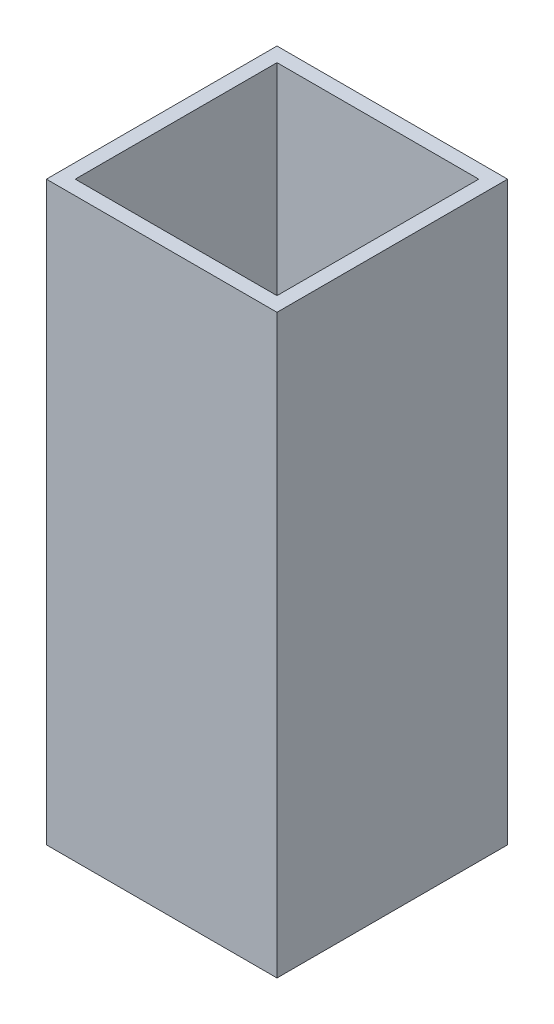
ISO-10303-21;
HEADER;
FILE_DESCRIPTION(('STEP AP214'),'2;1');
FILE_NAME('part.step','',(''),(''),'','','');
FILE_SCHEMA(('AUTOMOTIVE_DESIGN { 1 0 10303 214 1 1 1 1 }'));
ENDSEC;
DATA;
#1=APPLICATION_CONTEXT('core data for automotive mechanical design processes');
#2=APPLICATION_PROTOCOL_DEFINITION('international standard','automotive_design',2000,#1);
#3=PRODUCT_CONTEXT('',#1,'mechanical');
#4=PRODUCT('Part','Part','',(#3));
#5=PRODUCT_RELATED_PRODUCT_CATEGORY('part','',(#4));
#6=PRODUCT_DEFINITION_FORMATION('','',#4);
#7=PRODUCT_DEFINITION_CONTEXT('part definition',#1,'design');
#8=PRODUCT_DEFINITION('design','',#6,#7);
#9=PRODUCT_DEFINITION_SHAPE('','',#8);
#10=(LENGTH_UNIT() NAMED_UNIT(*) SI_UNIT(.MILLI.,.METRE.));
#11=(NAMED_UNIT(*) PLANE_ANGLE_UNIT() SI_UNIT($,.RADIAN.));
#12=(NAMED_UNIT(*) SI_UNIT($,.STERADIAN.) SOLID_ANGLE_UNIT());
#13=UNCERTAINTY_MEASURE_WITH_UNIT(LENGTH_MEASURE(1.E-05),#10,'distance_accuracy_value','');
#14=(GEOMETRIC_REPRESENTATION_CONTEXT(3) GLOBAL_UNCERTAINTY_ASSIGNED_CONTEXT((#13)) GLOBAL_UNIT_ASSIGNED_CONTEXT((#10,
#11,#12)) REPRESENTATION_CONTEXT('',''));
#15=CARTESIAN_POINT('',(0.,0.,0.));
#16=DIRECTION('',(0.,0.,1.));
#17=DIRECTION('',(1.,0.,0.));
#18=AXIS2_PLACEMENT_3D('',#15,#16,#17);
#19=CARTESIAN_POINT('',(0.,63.5,0.));
#20=DIRECTION('',(0.,-1.,0.));
#21=DIRECTION('',(0.,0.,-1.));
#22=AXIS2_PLACEMENT_3D('',#19,#20,#21);
#23=PLANE('',#22);
#24=DIRECTION('',(0.,0.,-1.));
#25=VECTOR('',#24,1.);
#26=CARTESIAN_POINT('',(12.7,63.5,12.7));
#27=LINE('',#26,#25);
#28=CARTESIAN_POINT('',(12.7,63.5,12.7));
#29=VERTEX_POINT('',#28);
#30=CARTESIAN_POINT('',(12.7,63.5,-12.7));
#31=VERTEX_POINT('',#30);
#32=EDGE_CURVE('E133',#29,#31,#27,.T.);
#33=ORIENTED_EDGE('',*,*,#32,.T.);
#34=DIRECTION('',(-1.,0.,0.));
#35=VECTOR('',#34,1.);
#36=CARTESIAN_POINT('',(-12.7,63.5,-12.7));
#37=LINE('',#36,#35);
#38=CARTESIAN_POINT('',(-12.7,63.5,-12.7));
#39=VERTEX_POINT('',#38);
#40=EDGE_CURVE('E136',#31,#39,#37,.T.);
#41=ORIENTED_EDGE('',*,*,#40,.T.);
#42=DIRECTION('',(0.,0.,1.));
#43=VECTOR('',#42,1.);
#44=CARTESIAN_POINT('',(-12.7,63.5,12.7));
#45=LINE('',#44,#43);
#46=CARTESIAN_POINT('',(-12.7,63.5,12.7));
#47=VERTEX_POINT('',#46);
#48=EDGE_CURVE('E139',#39,#47,#45,.T.);
#49=ORIENTED_EDGE('',*,*,#48,.T.);
#50=DIRECTION('',(1.,0.,0.));
#51=VECTOR('',#50,1.);
#52=CARTESIAN_POINT('',(-12.7,63.5,12.7));
#53=LINE('',#52,#51);
#54=EDGE_CURVE('E141',#47,#29,#53,.T.);
#55=ORIENTED_EDGE('',*,*,#54,.T.);
#56=EDGE_LOOP('',(#33,#41,#49,#55));
#57=FACE_BOUND('',#56,.T.);
#58=DIRECTION('',(0.,0.,-1.));
#59=VECTOR('',#58,1.);
#60=CARTESIAN_POINT('',(11.1125,63.5,11.1125));
#61=LINE('',#60,#59);
#62=CARTESIAN_POINT('',(11.1125,63.5,11.1125));
#63=VERTEX_POINT('',#62);
#64=CARTESIAN_POINT('',(11.1125,63.5,-11.1125));
#65=VERTEX_POINT('',#64);
#66=EDGE_CURVE('E97',#63,#65,#61,.T.);
#67=ORIENTED_EDGE('',*,*,#66,.F.);
#68=DIRECTION('',(1.,0.,0.));
#69=VECTOR('',#68,1.);
#70=CARTESIAN_POINT('',(-11.1125,63.5,11.1125));
#71=LINE('',#70,#69);
#72=CARTESIAN_POINT('',(-11.1125,63.5,11.1125));
#73=VERTEX_POINT('',#72);
#74=EDGE_CURVE('E119',#73,#63,#71,.T.);
#75=ORIENTED_EDGE('',*,*,#74,.F.);
#76=DIRECTION('',(0.,0.,1.));
#77=VECTOR('',#76,1.);
#78=CARTESIAN_POINT('',(-11.1125,63.5,11.1125));
#79=LINE('',#78,#77);
#80=CARTESIAN_POINT('',(-11.1125,63.5,-11.1125));
#81=VERTEX_POINT('',#80);
#82=EDGE_CURVE('E117',#81,#73,#79,.T.);
#83=ORIENTED_EDGE('',*,*,#82,.F.);
#84=DIRECTION('',(-1.,0.,0.));
#85=VECTOR('',#84,1.);
#86=CARTESIAN_POINT('',(-11.1125,63.5,-11.1125));
#87=LINE('',#86,#85);
#88=EDGE_CURVE('E105',#65,#81,#87,.T.);
#89=ORIENTED_EDGE('',*,*,#88,.F.);
#90=EDGE_LOOP('',(#67,#75,#83,#89));
#91=FACE_BOUND('',#90,.T.);
#92=ADVANCED_FACE('F32',(#57,#91),#23,.F.);
#93=CARTESIAN_POINT('',(0.,0.,0.));
#94=DIRECTION('',(0.,-1.,0.));
#95=DIRECTION('',(0.,0.,-1.));
#96=AXIS2_PLACEMENT_3D('',#93,#94,#95);
#97=PLANE('',#96);
#98=DIRECTION('',(0.,0.,-1.));
#99=VECTOR('',#98,1.);
#100=CARTESIAN_POINT('',(12.7,0.,12.7));
#101=LINE('',#100,#99);
#102=CARTESIAN_POINT('',(12.7,0.,12.7));
#103=VERTEX_POINT('',#102);
#104=CARTESIAN_POINT('',(12.7,0.,-12.7));
#105=VERTEX_POINT('',#104);
#106=EDGE_CURVE('E113',#103,#105,#101,.T.);
#107=ORIENTED_EDGE('',*,*,#106,.F.);
#108=DIRECTION('',(1.,0.,0.));
#109=VECTOR('',#108,1.);
#110=CARTESIAN_POINT('',(-12.7,0.,12.7));
#111=LINE('',#110,#109);
#112=CARTESIAN_POINT('',(-12.7,0.,12.7));
#113=VERTEX_POINT('',#112);
#114=EDGE_CURVE('E137',#113,#103,#111,.T.);
#115=ORIENTED_EDGE('',*,*,#114,.F.);
#116=DIRECTION('',(0.,0.,1.));
#117=VECTOR('',#116,1.);
#118=CARTESIAN_POINT('',(-12.7,0.,12.7));
#119=LINE('',#118,#117);
#120=CARTESIAN_POINT('',(-12.7,0.,-12.7));
#121=VERTEX_POINT('',#120);
#122=EDGE_CURVE('E148',#121,#113,#119,.T.);
#123=ORIENTED_EDGE('',*,*,#122,.F.);
#124=DIRECTION('',(-1.,0.,0.));
#125=VECTOR('',#124,1.);
#126=CARTESIAN_POINT('',(-12.7,0.,-12.7));
#127=LINE('',#126,#125);
#128=EDGE_CURVE('E146',#105,#121,#127,.T.);
#129=ORIENTED_EDGE('',*,*,#128,.F.);
#130=EDGE_LOOP('',(#107,#115,#123,#129));
#131=FACE_BOUND('',#130,.T.);
#132=DIRECTION('',(1.,0.,0.));
#133=VECTOR('',#132,1.);
#134=CARTESIAN_POINT('',(-11.1125,0.,11.1125));
#135=LINE('',#134,#133);
#136=CARTESIAN_POINT('',(-11.1125,0.,11.1125));
#137=VERTEX_POINT('',#136);
#138=CARTESIAN_POINT('',(11.1125,0.,11.1125));
#139=VERTEX_POINT('',#138);
#140=EDGE_CURVE('E106',#137,#139,#135,.T.);
#141=ORIENTED_EDGE('',*,*,#140,.T.);
#142=DIRECTION('',(0.,0.,-1.));
#143=VECTOR('',#142,1.);
#144=CARTESIAN_POINT('',(11.1125,0.,11.1125));
#145=LINE('',#144,#143);
#146=CARTESIAN_POINT('',(11.1125,0.,-11.1125));
#147=VERTEX_POINT('',#146);
#148=EDGE_CURVE('E55',#139,#147,#145,.T.);
#149=ORIENTED_EDGE('',*,*,#148,.T.);
#150=DIRECTION('',(-1.,0.,0.));
#151=VECTOR('',#150,1.);
#152=CARTESIAN_POINT('',(-11.1125,0.,-11.1125));
#153=LINE('',#152,#151);
#154=CARTESIAN_POINT('',(-11.1125,0.,-11.1125));
#155=VERTEX_POINT('',#154);
#156=EDGE_CURVE('E112',#147,#155,#153,.T.);
#157=ORIENTED_EDGE('',*,*,#156,.T.);
#158=DIRECTION('',(0.,0.,1.));
#159=VECTOR('',#158,1.);
#160=CARTESIAN_POINT('',(-11.1125,0.,11.1125));
#161=LINE('',#160,#159);
#162=EDGE_CURVE('E125',#155,#137,#161,.T.);
#163=ORIENTED_EDGE('',*,*,#162,.T.);
#164=EDGE_LOOP('',(#141,#149,#157,#163));
#165=FACE_BOUND('',#164,.T.);
#166=ADVANCED_FACE('F166',(#131,#165),#97,.T.);
#167=CARTESIAN_POINT('',(12.7,63.5,12.7));
#168=DIRECTION('',(-1.,0.,0.));
#169=DIRECTION('',(0.,0.,1.));
#170=AXIS2_PLACEMENT_3D('',#167,#168,#169);
#171=PLANE('',#170);
#172=ORIENTED_EDGE('',*,*,#106,.T.);
#173=DIRECTION('',(0.,-1.,0.));
#174=VECTOR('',#173,1.);
#175=CARTESIAN_POINT('',(12.7,63.5,-12.7));
#176=LINE('',#175,#174);
#177=EDGE_CURVE('E11',#31,#105,#176,.T.);
#178=ORIENTED_EDGE('',*,*,#177,.F.);
#179=ORIENTED_EDGE('',*,*,#32,.F.);
#180=DIRECTION('',(0.,-1.,0.));
#181=VECTOR('',#180,1.);
#182=CARTESIAN_POINT('',(12.7,63.5,12.7));
#183=LINE('',#182,#181);
#184=EDGE_CURVE('E143',#29,#103,#183,.T.);
#185=ORIENTED_EDGE('',*,*,#184,.T.);
#186=EDGE_LOOP('',(#172,#178,#179,#185));
#187=FACE_BOUND('',#186,.T.);
#188=ADVANCED_FACE('F34',(#187),#171,.F.);
#189=CARTESIAN_POINT('',(-12.7,63.5,-12.7));
#190=DIRECTION('',(0.,0.,1.));
#191=DIRECTION('',(1.,0.,0.));
#192=AXIS2_PLACEMENT_3D('',#189,#190,#191);
#193=PLANE('',#192);
#194=ORIENTED_EDGE('',*,*,#128,.T.);
#195=DIRECTION('',(0.,-1.,0.));
#196=VECTOR('',#195,1.);
#197=CARTESIAN_POINT('',(-12.7,63.5,-12.7));
#198=LINE('',#197,#196);
#199=EDGE_CURVE('E40',#39,#121,#198,.T.);
#200=ORIENTED_EDGE('',*,*,#199,.F.);
#201=ORIENTED_EDGE('',*,*,#40,.F.);
#202=ORIENTED_EDGE('',*,*,#177,.T.);
#203=EDGE_LOOP('',(#194,#200,#201,#202));
#204=FACE_BOUND('',#203,.T.);
#205=ADVANCED_FACE('F176',(#204),#193,.F.);
#206=CARTESIAN_POINT('',(-12.7,63.5,12.7));
#207=DIRECTION('',(1.,0.,0.));
#208=DIRECTION('',(0.,0.,-1.));
#209=AXIS2_PLACEMENT_3D('',#206,#207,#208);
#210=PLANE('',#209);
#211=ORIENTED_EDGE('',*,*,#122,.T.);
#212=DIRECTION('',(0.,-1.,0.));
#213=VECTOR('',#212,1.);
#214=CARTESIAN_POINT('',(-12.7,63.5,12.7));
#215=LINE('',#214,#213);
#216=EDGE_CURVE('E153',#47,#113,#215,.T.);
#217=ORIENTED_EDGE('',*,*,#216,.F.);
#218=ORIENTED_EDGE('',*,*,#48,.F.);
#219=ORIENTED_EDGE('',*,*,#199,.T.);
#220=EDGE_LOOP('',(#211,#217,#218,#219));
#221=FACE_BOUND('',#220,.T.);
#222=ADVANCED_FACE('F160',(#221),#210,.F.);
#223=CARTESIAN_POINT('',(-12.7,63.5,12.7));
#224=DIRECTION('',(0.,0.,-1.));
#225=DIRECTION('',(-1.,0.,0.));
#226=AXIS2_PLACEMENT_3D('',#223,#224,#225);
#227=PLANE('',#226);
#228=ORIENTED_EDGE('',*,*,#114,.T.);
#229=ORIENTED_EDGE('',*,*,#184,.F.);
#230=ORIENTED_EDGE('',*,*,#54,.F.);
#231=ORIENTED_EDGE('',*,*,#216,.T.);
#232=EDGE_LOOP('',(#228,#229,#230,#231));
#233=FACE_BOUND('',#232,.T.);
#234=ADVANCED_FACE('F170',(#233),#227,.F.);
#235=CARTESIAN_POINT('',(11.1125,63.5,11.1125));
#236=DIRECTION('',(-1.,0.,0.));
#237=DIRECTION('',(0.,0.,1.));
#238=AXIS2_PLACEMENT_3D('',#235,#236,#237);
#239=PLANE('',#238);
#240=ORIENTED_EDGE('',*,*,#148,.F.);
#241=DIRECTION('',(0.,-1.,0.));
#242=VECTOR('',#241,1.);
#243=CARTESIAN_POINT('',(11.1125,63.5,11.1125));
#244=LINE('',#243,#242);
#245=EDGE_CURVE('E101',#63,#139,#244,.T.);
#246=ORIENTED_EDGE('',*,*,#245,.F.);
#247=ORIENTED_EDGE('',*,*,#66,.T.);
#248=DIRECTION('',(0.,-1.,0.));
#249=VECTOR('',#248,1.);
#250=CARTESIAN_POINT('',(11.1125,63.5,-11.1125));
#251=LINE('',#250,#249);
#252=EDGE_CURVE('E100',#65,#147,#251,.T.);
#253=ORIENTED_EDGE('',*,*,#252,.T.);
#254=EDGE_LOOP('',(#240,#246,#247,#253));
#255=FACE_BOUND('',#254,.T.);
#256=ADVANCED_FACE('F99',(#255),#239,.T.);
#257=CARTESIAN_POINT('',(-11.1125,63.5,-11.1125));
#258=DIRECTION('',(0.,0.,1.));
#259=DIRECTION('',(1.,0.,0.));
#260=AXIS2_PLACEMENT_3D('',#257,#258,#259);
#261=PLANE('',#260);
#262=ORIENTED_EDGE('',*,*,#156,.F.);
#263=ORIENTED_EDGE('',*,*,#252,.F.);
#264=ORIENTED_EDGE('',*,*,#88,.T.);
#265=DIRECTION('',(0.,-1.,0.));
#266=VECTOR('',#265,1.);
#267=CARTESIAN_POINT('',(-11.1125,63.5,-11.1125));
#268=LINE('',#267,#266);
#269=EDGE_CURVE('E114',#81,#155,#268,.T.);
#270=ORIENTED_EDGE('',*,*,#269,.T.);
#271=EDGE_LOOP('',(#262,#263,#264,#270));
#272=FACE_BOUND('',#271,.T.);
#273=ADVANCED_FACE('F109',(#272),#261,.T.);
#274=CARTESIAN_POINT('',(-11.1125,63.5,11.1125));
#275=DIRECTION('',(1.,0.,0.));
#276=DIRECTION('',(0.,0.,-1.));
#277=AXIS2_PLACEMENT_3D('',#274,#275,#276);
#278=PLANE('',#277);
#279=ORIENTED_EDGE('',*,*,#162,.F.);
#280=ORIENTED_EDGE('',*,*,#269,.F.);
#281=ORIENTED_EDGE('',*,*,#82,.T.);
#282=DIRECTION('',(0.,-1.,0.));
#283=VECTOR('',#282,1.);
#284=CARTESIAN_POINT('',(-11.1125,63.5,11.1125));
#285=LINE('',#284,#283);
#286=EDGE_CURVE('E47',#73,#137,#285,.T.);
#287=ORIENTED_EDGE('',*,*,#286,.T.);
#288=EDGE_LOOP('',(#279,#280,#281,#287));
#289=FACE_BOUND('',#288,.T.);
#290=ADVANCED_FACE('F199',(#289),#278,.T.);
#291=CARTESIAN_POINT('',(-11.1125,63.5,11.1125));
#292=DIRECTION('',(0.,0.,-1.));
#293=DIRECTION('',(-1.,0.,0.));
#294=AXIS2_PLACEMENT_3D('',#291,#292,#293);
#295=PLANE('',#294);
#296=ORIENTED_EDGE('',*,*,#140,.F.);
#297=ORIENTED_EDGE('',*,*,#286,.F.);
#298=ORIENTED_EDGE('',*,*,#74,.T.);
#299=ORIENTED_EDGE('',*,*,#245,.T.);
#300=EDGE_LOOP('',(#296,#297,#298,#299));
#301=FACE_BOUND('',#300,.T.);
#302=ADVANCED_FACE('F203',(#301),#295,.T.);
#303=CLOSED_SHELL('',(#92,#166,#188,#205,#222,#234,#256,#273,#290,#302));
#304=MANIFOLD_SOLID_BREP('B2',#303);
#305=ADVANCED_BREP_SHAPE_REPRESENTATION('',(#18,#304),#14);
#306=SHAPE_DEFINITION_REPRESENTATION(#9,#305);
ENDSEC;
END-ISO-10303-21;
